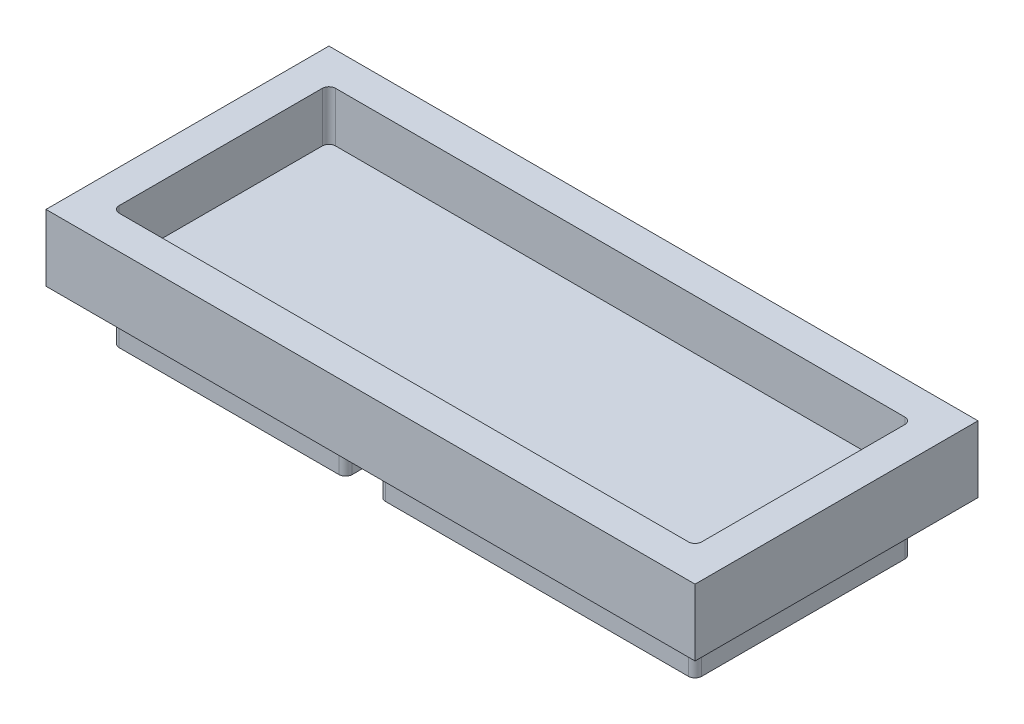
ISO-10303-21;
HEADER;
FILE_DESCRIPTION(('STEP AP214'),'2;1');
FILE_NAME('part.step','',(''),(''),'','','');
FILE_SCHEMA(('AUTOMOTIVE_DESIGN { 1 0 10303 214 1 1 1 1 }'));
ENDSEC;
DATA;
#1=APPLICATION_CONTEXT('core data for automotive mechanical design processes');
#2=APPLICATION_PROTOCOL_DEFINITION('international standard','automotive_design',2000,#1);
#3=PRODUCT_CONTEXT('',#1,'mechanical');
#4=PRODUCT('Part','Part','',(#3));
#5=PRODUCT_RELATED_PRODUCT_CATEGORY('part','',(#4));
#6=PRODUCT_DEFINITION_FORMATION('','',#4);
#7=PRODUCT_DEFINITION_CONTEXT('part definition',#1,'design');
#8=PRODUCT_DEFINITION('design','',#6,#7);
#9=PRODUCT_DEFINITION_SHAPE('','',#8);
#10=(LENGTH_UNIT() NAMED_UNIT(*) SI_UNIT(.MILLI.,.METRE.));
#11=(NAMED_UNIT(*) PLANE_ANGLE_UNIT() SI_UNIT($,.RADIAN.));
#12=(NAMED_UNIT(*) SI_UNIT($,.STERADIAN.) SOLID_ANGLE_UNIT());
#13=UNCERTAINTY_MEASURE_WITH_UNIT(LENGTH_MEASURE(1.E-05),#10,'distance_accuracy_value','');
#14=(GEOMETRIC_REPRESENTATION_CONTEXT(3) GLOBAL_UNCERTAINTY_ASSIGNED_CONTEXT((#13)) GLOBAL_UNIT_ASSIGNED_CONTEXT((#10,
#11,#12)) REPRESENTATION_CONTEXT('',''));
#15=CARTESIAN_POINT('',(0.,0.,0.));
#16=DIRECTION('',(0.,0.,1.));
#17=DIRECTION('',(1.,0.,0.));
#18=AXIS2_PLACEMENT_3D('',#15,#16,#17);
#19=CARTESIAN_POINT('',(-4.8482142857143,15.,3.70535714285713));
#20=DIRECTION('',(-1.,0.,0.));
#21=DIRECTION('',(0.,0.,1.));
#22=AXIS2_PLACEMENT_3D('',#19,#20,#21);
#23=PLANE('',#22);
#24=DIRECTION('',(0.,0.,-1.));
#25=VECTOR('',#24,1.);
#26=CARTESIAN_POINT('',(-4.8482142857143,0.,3.70535714285713));
#27=LINE('',#26,#25);
#28=CARTESIAN_POINT('',(-4.8482142857143,0.,3.70535714285713));
#29=VERTEX_POINT('',#28);
#30=CARTESIAN_POINT('',(-4.8482142857143,0.,-57.2946428571428));
#31=VERTEX_POINT('',#30);
#32=EDGE_CURVE('E419',#29,#31,#27,.T.);
#33=ORIENTED_EDGE('',*,*,#32,.T.);
#34=DIRECTION('',(0.,-1.,0.));
#35=VECTOR('',#34,1.);
#36=CARTESIAN_POINT('',(-4.8482142857143,15.,-57.2946428571428));
#37=LINE('',#36,#35);
#38=CARTESIAN_POINT('',(-4.8482142857143,15.,-57.2946428571428));
#39=VERTEX_POINT('',#38);
#40=EDGE_CURVE('E12',#39,#31,#37,.T.);
#41=ORIENTED_EDGE('',*,*,#40,.F.);
#42=DIRECTION('',(0.,0.,-1.));
#43=VECTOR('',#42,1.);
#44=CARTESIAN_POINT('',(-4.8482142857143,15.,3.70535714285713));
#45=LINE('',#44,#43);
#46=CARTESIAN_POINT('',(-4.8482142857143,15.,3.70535714285713));
#47=VERTEX_POINT('',#46);
#48=EDGE_CURVE('E420',#47,#39,#45,.T.);
#49=ORIENTED_EDGE('',*,*,#48,.F.);
#50=DIRECTION('',(0.,-1.,0.));
#51=VECTOR('',#50,1.);
#52=CARTESIAN_POINT('',(-4.8482142857143,15.,3.70535714285713));
#53=LINE('',#52,#51);
#54=EDGE_CURVE('E441',#47,#29,#53,.T.);
#55=ORIENTED_EDGE('',*,*,#54,.T.);
#56=EDGE_LOOP('',(#33,#41,#49,#55));
#57=FACE_BOUND('',#56,.T.);
#58=ADVANCED_FACE('F75',(#57),#23,.F.);
#59=CARTESIAN_POINT('',(-6.8482142857143,15.,-57.2946428571429));
#60=DIRECTION('',(0.,-1.,0.));
#61=DIRECTION('',(0.,0.,-1.));
#62=AXIS2_PLACEMENT_3D('',#59,#60,#61);
#63=CYLINDRICAL_SURFACE('',#62,2.);
#64=CARTESIAN_POINT('',(-6.8482142857143,0.,-57.2946428571429));
#65=DIRECTION('',(0.,1.,0.));
#66=DIRECTION('',(0.,0.,1.));
#67=AXIS2_PLACEMENT_3D('',#64,#65,#66);
#68=CIRCLE('',#67,2.);
#69=CARTESIAN_POINT('',(-6.84821428571432,0.,-59.2946428571429));
#70=VERTEX_POINT('',#69);
#71=EDGE_CURVE('E444',#31,#70,#68,.T.);
#72=ORIENTED_EDGE('',*,*,#71,.T.);
#73=DIRECTION('',(0.,-1.,0.));
#74=VECTOR('',#73,1.);
#75=CARTESIAN_POINT('',(-6.84821428571432,15.,-59.2946428571429));
#76=LINE('',#75,#74);
#77=CARTESIAN_POINT('',(-6.84821428571432,15.,-59.2946428571429));
#78=VERTEX_POINT('',#77);
#79=EDGE_CURVE('E82',#78,#70,#76,.T.);
#80=ORIENTED_EDGE('',*,*,#79,.F.);
#81=CARTESIAN_POINT('',(-6.8482142857143,15.,-57.2946428571429));
#82=DIRECTION('',(0.,1.,0.));
#83=DIRECTION('',(0.,0.,1.));
#84=AXIS2_PLACEMENT_3D('',#81,#82,#83);
#85=CIRCLE('',#84,2.);
#86=EDGE_CURVE('E422',#39,#78,#85,.T.);
#87=ORIENTED_EDGE('',*,*,#86,.F.);
#88=ORIENTED_EDGE('',*,*,#40,.T.);
#89=EDGE_LOOP('',(#72,#80,#87,#88));
#90=FACE_BOUND('',#89,.T.);
#91=ADVANCED_FACE('F481',(#90),#63,.T.);
#92=CARTESIAN_POINT('',(-72.8482142857143,15.,-59.2946428571429));
#93=DIRECTION('',(0.,0.,-1.));
#94=DIRECTION('',(-1.,0.,0.));
#95=AXIS2_PLACEMENT_3D('',#92,#93,#94);
#96=PLANE('',#95);
#97=DIRECTION('',(1.,0.,0.));
#98=VECTOR('',#97,1.);
#99=CARTESIAN_POINT('',(-72.8482142857143,0.,-59.2946428571429));
#100=LINE('',#99,#98);
#101=CARTESIAN_POINT('',(-72.8482142857143,0.,-59.2946428571429));
#102=VERTEX_POINT('',#101);
#103=EDGE_CURVE('E447',#102,#70,#100,.T.);
#104=ORIENTED_EDGE('',*,*,#103,.F.);
#105=DIRECTION('',(0.,-1.,0.));
#106=VECTOR('',#105,1.);
#107=CARTESIAN_POINT('',(-72.8482142857143,15.,-59.2946428571429));
#108=LINE('',#107,#106);
#109=CARTESIAN_POINT('',(-72.8482142857143,15.,-59.2946428571429));
#110=VERTEX_POINT('',#109);
#111=EDGE_CURVE('E473',#110,#102,#108,.T.);
#112=ORIENTED_EDGE('',*,*,#111,.F.);
#113=DIRECTION('',(1.,0.,0.));
#114=VECTOR('',#113,1.);
#115=CARTESIAN_POINT('',(-72.8482142857143,15.,-59.2946428571429));
#116=LINE('',#115,#114);
#117=EDGE_CURVE('E425',#110,#78,#116,.T.);
#118=ORIENTED_EDGE('',*,*,#117,.T.);
#119=ORIENTED_EDGE('',*,*,#79,.T.);
#120=EDGE_LOOP('',(#104,#112,#118,#119));
#121=FACE_BOUND('',#120,.T.);
#122=ADVANCED_FACE('F477',(#121),#96,.T.);
#123=CARTESIAN_POINT('',(-72.8482142857143,15.,-57.2946428571429));
#124=DIRECTION('',(0.,-1.,0.));
#125=DIRECTION('',(0.,0.,-1.));
#126=AXIS2_PLACEMENT_3D('',#123,#124,#125);
#127=CYLINDRICAL_SURFACE('',#126,2.);
#128=CARTESIAN_POINT('',(-72.8482142857143,0.,-57.2946428571429));
#129=DIRECTION('',(0.,-1.,0.));
#130=DIRECTION('',(0.,0.,-1.));
#131=AXIS2_PLACEMENT_3D('',#128,#129,#130);
#132=CIRCLE('',#131,2.);
#133=CARTESIAN_POINT('',(-74.8482142857143,0.,-57.2946428571428));
#134=VERTEX_POINT('',#133);
#135=EDGE_CURVE('E450',#134,#102,#132,.T.);
#136=ORIENTED_EDGE('',*,*,#135,.F.);
#137=DIRECTION('',(0.,-1.,0.));
#138=VECTOR('',#137,1.);
#139=CARTESIAN_POINT('',(-74.8482142857143,15.,-57.2946428571428));
#140=LINE('',#139,#138);
#141=CARTESIAN_POINT('',(-74.8482142857143,15.,-57.2946428571428));
#142=VERTEX_POINT('',#141);
#143=EDGE_CURVE('E471',#142,#134,#140,.T.);
#144=ORIENTED_EDGE('',*,*,#143,.F.);
#145=CARTESIAN_POINT('',(-72.8482142857143,15.,-57.2946428571429));
#146=DIRECTION('',(0.,-1.,0.));
#147=DIRECTION('',(0.,0.,-1.));
#148=AXIS2_PLACEMENT_3D('',#145,#146,#147);
#149=CIRCLE('',#148,2.);
#150=EDGE_CURVE('E428',#142,#110,#149,.T.);
#151=ORIENTED_EDGE('',*,*,#150,.T.);
#152=ORIENTED_EDGE('',*,*,#111,.T.);
#153=EDGE_LOOP('',(#136,#144,#151,#152));
#154=FACE_BOUND('',#153,.T.);
#155=ADVANCED_FACE('F491',(#154),#127,.T.);
#156=CARTESIAN_POINT('',(-74.8482142857143,15.,3.70535714285713));
#157=DIRECTION('',(-1.,0.,0.));
#158=DIRECTION('',(0.,0.,1.));
#159=AXIS2_PLACEMENT_3D('',#156,#157,#158);
#160=PLANE('',#159);
#161=DIRECTION('',(0.,0.,-1.));
#162=VECTOR('',#161,1.);
#163=CARTESIAN_POINT('',(-74.8482142857143,0.,3.70535714285713));
#164=LINE('',#163,#162);
#165=CARTESIAN_POINT('',(-74.8482142857143,0.,3.70535714285713));
#166=VERTEX_POINT('',#165);
#167=EDGE_CURVE('E453',#166,#134,#164,.T.);
#168=ORIENTED_EDGE('',*,*,#167,.F.);
#169=DIRECTION('',(0.,-1.,0.));
#170=VECTOR('',#169,1.);
#171=CARTESIAN_POINT('',(-74.8482142857143,15.,3.70535714285713));
#172=LINE('',#171,#170);
#173=CARTESIAN_POINT('',(-74.8482142857143,15.,3.70535714285713));
#174=VERTEX_POINT('',#173);
#175=EDGE_CURVE('E469',#174,#166,#172,.T.);
#176=ORIENTED_EDGE('',*,*,#175,.F.);
#177=DIRECTION('',(0.,0.,-1.));
#178=VECTOR('',#177,1.);
#179=CARTESIAN_POINT('',(-74.8482142857143,15.,3.70535714285713));
#180=LINE('',#179,#178);
#181=EDGE_CURVE('E431',#174,#142,#180,.T.);
#182=ORIENTED_EDGE('',*,*,#181,.T.);
#183=ORIENTED_EDGE('',*,*,#143,.T.);
#184=EDGE_LOOP('',(#168,#176,#182,#183));
#185=FACE_BOUND('',#184,.T.);
#186=ADVANCED_FACE('F509',(#185),#160,.T.);
#187=CARTESIAN_POINT('',(-72.8482142857143,15.,3.70535714285715));
#188=DIRECTION('',(0.,-1.,0.));
#189=DIRECTION('',(0.,0.,-1.));
#190=AXIS2_PLACEMENT_3D('',#187,#188,#189);
#191=CYLINDRICAL_SURFACE('',#190,2.);
#192=CARTESIAN_POINT('',(-72.8482142857143,0.,3.70535714285715));
#193=DIRECTION('',(0.,1.,0.));
#194=DIRECTION('',(0.,0.,1.));
#195=AXIS2_PLACEMENT_3D('',#192,#193,#194);
#196=CIRCLE('',#195,2.);
#197=CARTESIAN_POINT('',(-72.8482142857143,0.,5.70535714285715));
#198=VERTEX_POINT('',#197);
#199=EDGE_CURVE('E456',#166,#198,#196,.T.);
#200=ORIENTED_EDGE('',*,*,#199,.T.);
#201=DIRECTION('',(0.,-1.,0.));
#202=VECTOR('',#201,1.);
#203=CARTESIAN_POINT('',(-72.8482142857143,15.,5.70535714285715));
#204=LINE('',#203,#202);
#205=CARTESIAN_POINT('',(-72.8482142857143,15.,5.70535714285715));
#206=VERTEX_POINT('',#205);
#207=EDGE_CURVE('E466',#206,#198,#204,.T.);
#208=ORIENTED_EDGE('',*,*,#207,.F.);
#209=CARTESIAN_POINT('',(-72.8482142857143,15.,3.70535714285715));
#210=DIRECTION('',(0.,1.,0.));
#211=DIRECTION('',(0.,0.,1.));
#212=AXIS2_PLACEMENT_3D('',#209,#210,#211);
#213=CIRCLE('',#212,2.);
#214=EDGE_CURVE('E434',#174,#206,#213,.T.);
#215=ORIENTED_EDGE('',*,*,#214,.F.);
#216=ORIENTED_EDGE('',*,*,#175,.T.);
#217=EDGE_LOOP('',(#200,#208,#215,#216));
#218=FACE_BOUND('',#217,.T.);
#219=ADVANCED_FACE('F511',(#218),#191,.T.);
#220=CARTESIAN_POINT('',(-72.8482142857143,15.,5.70535714285715));
#221=DIRECTION('',(0.,0.,-1.));
#222=DIRECTION('',(-1.,0.,0.));
#223=AXIS2_PLACEMENT_3D('',#220,#221,#222);
#224=PLANE('',#223);
#225=DIRECTION('',(1.,0.,0.));
#226=VECTOR('',#225,1.);
#227=CARTESIAN_POINT('',(-72.8482142857143,0.,5.70535714285715));
#228=LINE('',#227,#226);
#229=CARTESIAN_POINT('',(-6.84821428571432,0.,5.70535714285715));
#230=VERTEX_POINT('',#229);
#231=EDGE_CURVE('E458',#198,#230,#228,.T.);
#232=ORIENTED_EDGE('',*,*,#231,.T.);
#233=DIRECTION('',(0.,-1.,0.));
#234=VECTOR('',#233,1.);
#235=CARTESIAN_POINT('',(-6.84821428571432,15.,5.70535714285715));
#236=LINE('',#235,#234);
#237=CARTESIAN_POINT('',(-6.84821428571432,15.,5.70535714285715));
#238=VERTEX_POINT('',#237);
#239=EDGE_CURVE('E464',#238,#230,#236,.T.);
#240=ORIENTED_EDGE('',*,*,#239,.F.);
#241=DIRECTION('',(1.,0.,0.));
#242=VECTOR('',#241,1.);
#243=CARTESIAN_POINT('',(-72.8482142857143,15.,5.70535714285715));
#244=LINE('',#243,#242);
#245=EDGE_CURVE('E436',#206,#238,#244,.T.);
#246=ORIENTED_EDGE('',*,*,#245,.F.);
#247=ORIENTED_EDGE('',*,*,#207,.T.);
#248=EDGE_LOOP('',(#232,#240,#246,#247));
#249=FACE_BOUND('',#248,.T.);
#250=ADVANCED_FACE('F505',(#249),#224,.F.);
#251=CARTESIAN_POINT('',(-6.8482142857143,15.,3.70535714285715));
#252=DIRECTION('',(0.,-1.,0.));
#253=DIRECTION('',(0.,0.,-1.));
#254=AXIS2_PLACEMENT_3D('',#251,#252,#253);
#255=CYLINDRICAL_SURFACE('',#254,2.);
#256=CARTESIAN_POINT('',(-6.8482142857143,0.,3.70535714285715));
#257=DIRECTION('',(0.,-1.,0.));
#258=DIRECTION('',(0.,0.,-1.));
#259=AXIS2_PLACEMENT_3D('',#256,#257,#258);
#260=CIRCLE('',#259,2.);
#261=EDGE_CURVE('E423',#29,#230,#260,.T.);
#262=ORIENTED_EDGE('',*,*,#261,.F.);
#263=ORIENTED_EDGE('',*,*,#54,.F.);
#264=CARTESIAN_POINT('',(-6.8482142857143,15.,3.70535714285715));
#265=DIRECTION('',(0.,-1.,0.));
#266=DIRECTION('',(0.,0.,-1.));
#267=AXIS2_PLACEMENT_3D('',#264,#265,#266);
#268=CIRCLE('',#267,2.);
#269=EDGE_CURVE('E438',#47,#238,#268,.T.);
#270=ORIENTED_EDGE('',*,*,#269,.T.);
#271=ORIENTED_EDGE('',*,*,#239,.T.);
#272=EDGE_LOOP('',(#262,#263,#270,#271));
#273=FACE_BOUND('',#272,.T.);
#274=ADVANCED_FACE('F501',(#273),#255,.T.);
#275=CARTESIAN_POINT('',(-6.8482142857143,0.,-57.2946428571429));
#276=DIRECTION('',(0.,1.,0.));
#277=DIRECTION('',(0.,0.,1.));
#278=AXIS2_PLACEMENT_3D('',#275,#276,#277);
#279=PLANE('',#278);
#280=ORIENTED_EDGE('',*,*,#32,.F.);
#281=ORIENTED_EDGE('',*,*,#261,.T.);
#282=ORIENTED_EDGE('',*,*,#231,.F.);
#283=ORIENTED_EDGE('',*,*,#199,.F.);
#284=ORIENTED_EDGE('',*,*,#167,.T.);
#285=ORIENTED_EDGE('',*,*,#135,.T.);
#286=ORIENTED_EDGE('',*,*,#103,.T.);
#287=ORIENTED_EDGE('',*,*,#71,.F.);
#288=EDGE_LOOP('',(#280,#281,#282,#283,#284,#285,#286,#287));
#289=FACE_BOUND('',#288,.T.);
#290=ADVANCED_FACE('F485',(#289),#279,.F.);
#291=CARTESIAN_POINT('',(0.,15.,0.));
#292=DIRECTION('',(0.,1.,0.));
#293=DIRECTION('',(0.,0.,1.));
#294=AXIS2_PLACEMENT_3D('',#291,#292,#293);
#295=PLANE('',#294);
#296=DIRECTION('',(1.,0.,0.));
#297=VECTOR('',#296,1.);
#298=CARTESIAN_POINT('',(7.15178571428571,15.,5.70535714285715));
#299=LINE('',#298,#297);
#300=CARTESIAN_POINT('',(7.1517857142857,15.,5.70535714285715));
#301=VERTEX_POINT('',#300);
#302=CARTESIAN_POINT('',(98.1517857142857,15.,5.70535714285715));
#303=VERTEX_POINT('',#302);
#304=EDGE_CURVE('E396',#301,#303,#299,.T.);
#305=ORIENTED_EDGE('',*,*,#304,.T.);
#306=CARTESIAN_POINT('',(98.1517857142857,15.,3.70535714285715));
#307=DIRECTION('',(0.,-1.,0.));
#308=DIRECTION('',(0.,0.,-1.));
#309=AXIS2_PLACEMENT_3D('',#306,#307,#308);
#310=CIRCLE('',#309,2.);
#311=CARTESIAN_POINT('',(100.151785714286,15.,3.70535714285713));
#312=VERTEX_POINT('',#311);
#313=EDGE_CURVE('E97',#312,#303,#310,.T.);
#314=ORIENTED_EDGE('',*,*,#313,.F.);
#315=DIRECTION('',(0.,0.,-1.));
#316=VECTOR('',#315,1.);
#317=CARTESIAN_POINT('',(100.151785714286,15.,3.70535714285713));
#318=LINE('',#317,#316);
#319=CARTESIAN_POINT('',(100.151785714286,15.,-57.2946428571428));
#320=VERTEX_POINT('',#319);
#321=EDGE_CURVE('E342',#312,#320,#318,.T.);
#322=ORIENTED_EDGE('',*,*,#321,.T.);
#323=CARTESIAN_POINT('',(98.1517857142857,15.,-57.2946428571429));
#324=DIRECTION('',(0.,-1.,0.));
#325=DIRECTION('',(0.,0.,-1.));
#326=AXIS2_PLACEMENT_3D('',#323,#324,#325);
#327=CIRCLE('',#326,2.);
#328=CARTESIAN_POINT('',(98.1517857142857,15.,-59.2946428571429));
#329=VERTEX_POINT('',#328);
#330=EDGE_CURVE('E382',#329,#320,#327,.T.);
#331=ORIENTED_EDGE('',*,*,#330,.F.);
#332=DIRECTION('',(1.,0.,0.));
#333=VECTOR('',#332,1.);
#334=CARTESIAN_POINT('',(7.15178571428571,15.,-59.2946428571429));
#335=LINE('',#334,#333);
#336=CARTESIAN_POINT('',(7.15178571428571,15.,-59.2946428571429));
#337=VERTEX_POINT('',#336);
#338=EDGE_CURVE('E385',#337,#329,#335,.T.);
#339=ORIENTED_EDGE('',*,*,#338,.F.);
#340=CARTESIAN_POINT('',(7.1517857142857,15.,-57.2946428571429));
#341=DIRECTION('',(0.,-1.,0.));
#342=DIRECTION('',(0.,0.,-1.));
#343=AXIS2_PLACEMENT_3D('',#340,#341,#342);
#344=CIRCLE('',#343,2.);
#345=CARTESIAN_POINT('',(5.1517857142857,15.,-57.2946428571428));
#346=VERTEX_POINT('',#345);
#347=EDGE_CURVE('E388',#346,#337,#344,.T.);
#348=ORIENTED_EDGE('',*,*,#347,.F.);
#349=DIRECTION('',(0.,0.,-1.));
#350=VECTOR('',#349,1.);
#351=CARTESIAN_POINT('',(5.1517857142857,15.,3.70535714285713));
#352=LINE('',#351,#350);
#353=CARTESIAN_POINT('',(5.1517857142857,15.,3.70535714285713));
#354=VERTEX_POINT('',#353);
#355=EDGE_CURVE('E391',#354,#346,#352,.T.);
#356=ORIENTED_EDGE('',*,*,#355,.F.);
#357=CARTESIAN_POINT('',(7.1517857142857,15.,3.70535714285715));
#358=DIRECTION('',(0.,1.,0.));
#359=DIRECTION('',(0.,0.,1.));
#360=AXIS2_PLACEMENT_3D('',#357,#358,#359);
#361=CIRCLE('',#360,2.);
#362=EDGE_CURVE('E394',#354,#301,#361,.T.);
#363=ORIENTED_EDGE('',*,*,#362,.T.);
#364=EDGE_LOOP('',(#305,#314,#322,#331,#339,#348,#356,#363));
#365=FACE_BOUND('',#364,.T.);
#366=DIRECTION('',(0.,0.,1.));
#367=VECTOR('',#366,1.);
#368=CARTESIAN_POINT('',(-84.8482142857143,15.,-69.2946428571429));
#369=LINE('',#368,#367);
#370=CARTESIAN_POINT('',(-84.8482142857143,15.,-69.2946428571429));
#371=VERTEX_POINT('',#370);
#372=CARTESIAN_POINT('',(-84.8482142857143,15.,15.7053571428571));
#373=VERTEX_POINT('',#372);
#374=EDGE_CURVE('E380',#371,#373,#369,.T.);
#375=ORIENTED_EDGE('',*,*,#374,.F.);
#376=DIRECTION('',(-1.,0.,0.));
#377=VECTOR('',#376,1.);
#378=CARTESIAN_POINT('',(-84.8482142857143,15.,-69.2946428571429));
#379=LINE('',#378,#377);
#380=CARTESIAN_POINT('',(110.151785714286,15.,-69.2946428571429));
#381=VERTEX_POINT('',#380);
#382=EDGE_CURVE('E405',#381,#371,#379,.T.);
#383=ORIENTED_EDGE('',*,*,#382,.F.);
#384=DIRECTION('',(0.,0.,-1.));
#385=VECTOR('',#384,1.);
#386=CARTESIAN_POINT('',(110.151785714286,15.,-69.2946428571429));
#387=LINE('',#386,#385);
#388=CARTESIAN_POINT('',(110.151785714286,15.,15.7053571428571));
#389=VERTEX_POINT('',#388);
#390=EDGE_CURVE('E403',#389,#381,#387,.T.);
#391=ORIENTED_EDGE('',*,*,#390,.F.);
#392=DIRECTION('',(1.,0.,0.));
#393=VECTOR('',#392,1.);
#394=CARTESIAN_POINT('',(-84.8482142857143,15.,15.7053571428571));
#395=LINE('',#394,#393);
#396=EDGE_CURVE('E401',#373,#389,#395,.T.);
#397=ORIENTED_EDGE('',*,*,#396,.F.);
#398=EDGE_LOOP('',(#375,#383,#391,#397));
#399=FACE_BOUND('',#398,.T.);
#400=ORIENTED_EDGE('',*,*,#269,.F.);
#401=ORIENTED_EDGE('',*,*,#48,.T.);
#402=ORIENTED_EDGE('',*,*,#86,.T.);
#403=ORIENTED_EDGE('',*,*,#117,.F.);
#404=ORIENTED_EDGE('',*,*,#150,.F.);
#405=ORIENTED_EDGE('',*,*,#181,.F.);
#406=ORIENTED_EDGE('',*,*,#214,.T.);
#407=ORIENTED_EDGE('',*,*,#245,.T.);
#408=EDGE_LOOP('',(#400,#401,#402,#403,#404,#405,#406,#407));
#409=FACE_BOUND('',#408,.T.);
#410=ADVANCED_FACE('F493',(#365,#399,#409),#295,.F.);
#411=CARTESIAN_POINT('',(-84.8482142857143,20.,-69.2946428571429));
#412=DIRECTION('',(1.,0.,0.));
#413=DIRECTION('',(0.,0.,-1.));
#414=AXIS2_PLACEMENT_3D('',#411,#412,#413);
#415=PLANE('',#414);
#416=ORIENTED_EDGE('',*,*,#374,.T.);
#417=DIRECTION('',(0.,-1.,0.));
#418=VECTOR('',#417,1.);
#419=CARTESIAN_POINT('',(-84.8482142857143,20.,15.7053571428571));
#420=LINE('',#419,#418);
#421=CARTESIAN_POINT('',(-84.8482142857143,35.,15.7053571428571));
#422=VERTEX_POINT('',#421);
#423=EDGE_CURVE('E416',#422,#373,#420,.T.);
#424=ORIENTED_EDGE('',*,*,#423,.F.);
#425=DIRECTION('',(0.,0.,1.));
#426=VECTOR('',#425,1.);
#427=CARTESIAN_POINT('',(-84.8482142857143,35.,-69.2946428571429));
#428=LINE('',#427,#426);
#429=CARTESIAN_POINT('',(-84.8482142857143,35.,-69.2946428571429));
#430=VERTEX_POINT('',#429);
#431=EDGE_CURVE('E330',#430,#422,#428,.T.);
#432=ORIENTED_EDGE('',*,*,#431,.F.);
#433=DIRECTION('',(0.,-1.,0.));
#434=VECTOR('',#433,1.);
#435=CARTESIAN_POINT('',(-84.8482142857143,20.,-69.2946428571429));
#436=LINE('',#435,#434);
#437=EDGE_CURVE('E407',#430,#371,#436,.T.);
#438=ORIENTED_EDGE('',*,*,#437,.T.);
#439=EDGE_LOOP('',(#416,#424,#432,#438));
#440=FACE_BOUND('',#439,.T.);
#441=ADVANCED_FACE('F657',(#440),#415,.F.);
#442=CARTESIAN_POINT('',(-84.8482142857143,20.,15.7053571428571));
#443=DIRECTION('',(0.,0.,-1.));
#444=DIRECTION('',(-1.,0.,0.));
#445=AXIS2_PLACEMENT_3D('',#442,#443,#444);
#446=PLANE('',#445);
#447=ORIENTED_EDGE('',*,*,#396,.T.);
#448=DIRECTION('',(0.,-1.,0.));
#449=VECTOR('',#448,1.);
#450=CARTESIAN_POINT('',(110.151785714286,20.,15.7053571428571));
#451=LINE('',#450,#449);
#452=CARTESIAN_POINT('',(110.151785714286,35.,15.7053571428571));
#453=VERTEX_POINT('',#452);
#454=EDGE_CURVE('E413',#453,#389,#451,.T.);
#455=ORIENTED_EDGE('',*,*,#454,.F.);
#456=DIRECTION('',(1.,0.,0.));
#457=VECTOR('',#456,1.);
#458=CARTESIAN_POINT('',(-84.8482142857143,35.,15.7053571428571));
#459=LINE('',#458,#457);
#460=EDGE_CURVE('E333',#422,#453,#459,.T.);
#461=ORIENTED_EDGE('',*,*,#460,.F.);
#462=ORIENTED_EDGE('',*,*,#423,.T.);
#463=EDGE_LOOP('',(#447,#455,#461,#462));
#464=FACE_BOUND('',#463,.T.);
#465=ADVANCED_FACE('F667',(#464),#446,.F.);
#466=CARTESIAN_POINT('',(110.151785714286,20.,-69.2946428571429));
#467=DIRECTION('',(-1.,0.,0.));
#468=DIRECTION('',(0.,0.,1.));
#469=AXIS2_PLACEMENT_3D('',#466,#467,#468);
#470=PLANE('',#469);
#471=ORIENTED_EDGE('',*,*,#390,.T.);
#472=DIRECTION('',(0.,-1.,0.));
#473=VECTOR('',#472,1.);
#474=CARTESIAN_POINT('',(110.151785714286,20.,-69.2946428571429));
#475=LINE('',#474,#473);
#476=CARTESIAN_POINT('',(110.151785714286,35.,-69.2946428571429));
#477=VERTEX_POINT('',#476);
#478=EDGE_CURVE('E410',#477,#381,#475,.T.);
#479=ORIENTED_EDGE('',*,*,#478,.F.);
#480=DIRECTION('',(0.,0.,-1.));
#481=VECTOR('',#480,1.);
#482=CARTESIAN_POINT('',(110.151785714286,35.,15.7053571428571));
#483=LINE('',#482,#481);
#484=EDGE_CURVE('E336',#453,#477,#483,.T.);
#485=ORIENTED_EDGE('',*,*,#484,.F.);
#486=ORIENTED_EDGE('',*,*,#454,.T.);
#487=EDGE_LOOP('',(#471,#479,#485,#486));
#488=FACE_BOUND('',#487,.T.);
#489=ADVANCED_FACE('F680',(#488),#470,.F.);
#490=CARTESIAN_POINT('',(-84.8482142857143,20.,-69.2946428571429));
#491=DIRECTION('',(0.,0.,1.));
#492=DIRECTION('',(1.,0.,0.));
#493=AXIS2_PLACEMENT_3D('',#490,#491,#492);
#494=PLANE('',#493);
#495=ORIENTED_EDGE('',*,*,#382,.T.);
#496=ORIENTED_EDGE('',*,*,#437,.F.);
#497=DIRECTION('',(-1.,0.,0.));
#498=VECTOR('',#497,1.);
#499=CARTESIAN_POINT('',(110.151785714286,35.,-69.2946428571429));
#500=LINE('',#499,#498);
#501=EDGE_CURVE('E276',#477,#430,#500,.T.);
#502=ORIENTED_EDGE('',*,*,#501,.F.);
#503=ORIENTED_EDGE('',*,*,#478,.T.);
#504=EDGE_LOOP('',(#495,#496,#502,#503));
#505=FACE_BOUND('',#504,.T.);
#506=ADVANCED_FACE('F578',(#505),#494,.F.);
#507=CARTESIAN_POINT('',(98.1517857142857,15.,3.70535714285715));
#508=DIRECTION('',(0.,-1.,0.));
#509=DIRECTION('',(0.,0.,-1.));
#510=AXIS2_PLACEMENT_3D('',#507,#508,#509);
#511=CYLINDRICAL_SURFACE('',#510,2.);
#512=CARTESIAN_POINT('',(98.1517857142857,0.,3.70535714285715));
#513=DIRECTION('',(0.,-1.,0.));
#514=DIRECTION('',(0.,0.,-1.));
#515=AXIS2_PLACEMENT_3D('',#512,#513,#514);
#516=CIRCLE('',#515,2.);
#517=CARTESIAN_POINT('',(100.151785714286,0.,3.70535714285713));
#518=VERTEX_POINT('',#517);
#519=CARTESIAN_POINT('',(98.1517857142857,0.,5.70535714285715));
#520=VERTEX_POINT('',#519);
#521=EDGE_CURVE('E377',#518,#520,#516,.T.);
#522=ORIENTED_EDGE('',*,*,#521,.F.);
#523=DIRECTION('',(0.,-1.,0.));
#524=VECTOR('',#523,1.);
#525=CARTESIAN_POINT('',(100.151785714286,15.,3.70535714285713));
#526=LINE('',#525,#524);
#527=EDGE_CURVE('E339',#312,#518,#526,.T.);
#528=ORIENTED_EDGE('',*,*,#527,.F.);
#529=ORIENTED_EDGE('',*,*,#313,.T.);
#530=DIRECTION('',(0.,-1.,0.));
#531=VECTOR('',#530,1.);
#532=CARTESIAN_POINT('',(98.1517857142857,15.,5.70535714285715));
#533=LINE('',#532,#531);
#534=EDGE_CURVE('E340',#303,#520,#533,.T.);
#535=ORIENTED_EDGE('',*,*,#534,.T.);
#536=EDGE_LOOP('',(#522,#528,#529,#535));
#537=FACE_BOUND('',#536,.T.);
#538=ADVANCED_FACE('F572',(#537),#511,.T.);
#539=CARTESIAN_POINT('',(100.151785714286,15.,3.70535714285713));
#540=DIRECTION('',(-1.,0.,0.));
#541=DIRECTION('',(0.,0.,1.));
#542=AXIS2_PLACEMENT_3D('',#539,#540,#541);
#543=PLANE('',#542);
#544=DIRECTION('',(0.,0.,-1.));
#545=VECTOR('',#544,1.);
#546=CARTESIAN_POINT('',(100.151785714286,0.,3.70535714285713));
#547=LINE('',#546,#545);
#548=CARTESIAN_POINT('',(100.151785714286,0.,-57.2946428571428));
#549=VERTEX_POINT('',#548);
#550=EDGE_CURVE('E357',#518,#549,#547,.T.);
#551=ORIENTED_EDGE('',*,*,#550,.T.);
#552=DIRECTION('',(0.,-1.,0.));
#553=VECTOR('',#552,1.);
#554=CARTESIAN_POINT('',(100.151785714286,15.,-57.2946428571428));
#555=LINE('',#554,#553);
#556=EDGE_CURVE('E354',#320,#549,#555,.T.);
#557=ORIENTED_EDGE('',*,*,#556,.F.);
#558=ORIENTED_EDGE('',*,*,#321,.F.);
#559=ORIENTED_EDGE('',*,*,#527,.T.);
#560=EDGE_LOOP('',(#551,#557,#558,#559));
#561=FACE_BOUND('',#560,.T.);
#562=ADVANCED_FACE('F577',(#561),#543,.F.);
#563=CARTESIAN_POINT('',(98.1517857142857,15.,-57.2946428571429));
#564=DIRECTION('',(0.,-1.,0.));
#565=DIRECTION('',(0.,0.,-1.));
#566=AXIS2_PLACEMENT_3D('',#563,#564,#565);
#567=CYLINDRICAL_SURFACE('',#566,2.);
#568=CARTESIAN_POINT('',(98.1517857142857,0.,-57.2946428571429));
#569=DIRECTION('',(0.,-1.,0.));
#570=DIRECTION('',(0.,0.,-1.));
#571=AXIS2_PLACEMENT_3D('',#568,#569,#570);
#572=CIRCLE('',#571,2.);
#573=CARTESIAN_POINT('',(98.1517857142857,0.,-59.2946428571429));
#574=VERTEX_POINT('',#573);
#575=EDGE_CURVE('E360',#574,#549,#572,.T.);
#576=ORIENTED_EDGE('',*,*,#575,.F.);
#577=DIRECTION('',(0.,-1.,0.));
#578=VECTOR('',#577,1.);
#579=CARTESIAN_POINT('',(98.1517857142857,15.,-59.2946428571429));
#580=LINE('',#579,#578);
#581=EDGE_CURVE('E352',#329,#574,#580,.T.);
#582=ORIENTED_EDGE('',*,*,#581,.F.);
#583=ORIENTED_EDGE('',*,*,#330,.T.);
#584=ORIENTED_EDGE('',*,*,#556,.T.);
#585=EDGE_LOOP('',(#576,#582,#583,#584));
#586=FACE_BOUND('',#585,.T.);
#587=ADVANCED_FACE('F587',(#586),#567,.T.);
#588=CARTESIAN_POINT('',(7.15178571428571,15.,-59.2946428571429));
#589=DIRECTION('',(0.,0.,-1.));
#590=DIRECTION('',(-1.,0.,0.));
#591=AXIS2_PLACEMENT_3D('',#588,#589,#590);
#592=PLANE('',#591);
#593=DIRECTION('',(1.,0.,0.));
#594=VECTOR('',#593,1.);
#595=CARTESIAN_POINT('',(7.15178571428571,0.,-59.2946428571429));
#596=LINE('',#595,#594);
#597=CARTESIAN_POINT('',(7.15178571428571,0.,-59.2946428571429));
#598=VERTEX_POINT('',#597);
#599=EDGE_CURVE('E363',#598,#574,#596,.T.);
#600=ORIENTED_EDGE('',*,*,#599,.F.);
#601=DIRECTION('',(0.,-1.,0.));
#602=VECTOR('',#601,1.);
#603=CARTESIAN_POINT('',(7.15178571428571,15.,-59.2946428571429));
#604=LINE('',#603,#602);
#605=EDGE_CURVE('E350',#337,#598,#604,.T.);
#606=ORIENTED_EDGE('',*,*,#605,.F.);
#607=ORIENTED_EDGE('',*,*,#338,.T.);
#608=ORIENTED_EDGE('',*,*,#581,.T.);
#609=EDGE_LOOP('',(#600,#606,#607,#608));
#610=FACE_BOUND('',#609,.T.);
#611=ADVANCED_FACE('F596',(#610),#592,.T.);
#612=CARTESIAN_POINT('',(7.1517857142857,15.,-57.2946428571429));
#613=DIRECTION('',(0.,-1.,0.));
#614=DIRECTION('',(0.,0.,-1.));
#615=AXIS2_PLACEMENT_3D('',#612,#613,#614);
#616=CYLINDRICAL_SURFACE('',#615,2.);
#617=CARTESIAN_POINT('',(7.1517857142857,0.,-57.2946428571429));
#618=DIRECTION('',(0.,-1.,0.));
#619=DIRECTION('',(0.,0.,-1.));
#620=AXIS2_PLACEMENT_3D('',#617,#618,#619);
#621=CIRCLE('',#620,2.);
#622=CARTESIAN_POINT('',(5.1517857142857,0.,-57.2946428571428));
#623=VERTEX_POINT('',#622);
#624=EDGE_CURVE('E366',#623,#598,#621,.T.);
#625=ORIENTED_EDGE('',*,*,#624,.F.);
#626=DIRECTION('',(0.,-1.,0.));
#627=VECTOR('',#626,1.);
#628=CARTESIAN_POINT('',(5.1517857142857,15.,-57.2946428571428));
#629=LINE('',#628,#627);
#630=EDGE_CURVE('E348',#346,#623,#629,.T.);
#631=ORIENTED_EDGE('',*,*,#630,.F.);
#632=ORIENTED_EDGE('',*,*,#347,.T.);
#633=ORIENTED_EDGE('',*,*,#605,.T.);
#634=EDGE_LOOP('',(#625,#631,#632,#633));
#635=FACE_BOUND('',#634,.T.);
#636=ADVANCED_FACE('F605',(#635),#616,.T.);
#637=CARTESIAN_POINT('',(5.1517857142857,15.,3.70535714285713));
#638=DIRECTION('',(-1.,0.,0.));
#639=DIRECTION('',(0.,0.,1.));
#640=AXIS2_PLACEMENT_3D('',#637,#638,#639);
#641=PLANE('',#640);
#642=DIRECTION('',(0.,0.,-1.));
#643=VECTOR('',#642,1.);
#644=CARTESIAN_POINT('',(5.1517857142857,0.,3.70535714285713));
#645=LINE('',#644,#643);
#646=CARTESIAN_POINT('',(5.1517857142857,0.,3.70535714285713));
#647=VERTEX_POINT('',#646);
#648=EDGE_CURVE('E369',#647,#623,#645,.T.);
#649=ORIENTED_EDGE('',*,*,#648,.F.);
#650=DIRECTION('',(0.,-1.,0.));
#651=VECTOR('',#650,1.);
#652=CARTESIAN_POINT('',(5.1517857142857,15.,3.70535714285713));
#653=LINE('',#652,#651);
#654=EDGE_CURVE('E346',#354,#647,#653,.T.);
#655=ORIENTED_EDGE('',*,*,#654,.F.);
#656=ORIENTED_EDGE('',*,*,#355,.T.);
#657=ORIENTED_EDGE('',*,*,#630,.T.);
#658=EDGE_LOOP('',(#649,#655,#656,#657));
#659=FACE_BOUND('',#658,.T.);
#660=ADVANCED_FACE('F614',(#659),#641,.T.);
#661=CARTESIAN_POINT('',(7.1517857142857,15.,3.70535714285715));
#662=DIRECTION('',(0.,-1.,0.));
#663=DIRECTION('',(0.,0.,-1.));
#664=AXIS2_PLACEMENT_3D('',#661,#662,#663);
#665=CYLINDRICAL_SURFACE('',#664,2.);
#666=CARTESIAN_POINT('',(7.1517857142857,0.,3.70535714285715));
#667=DIRECTION('',(0.,1.,0.));
#668=DIRECTION('',(0.,0.,1.));
#669=AXIS2_PLACEMENT_3D('',#666,#667,#668);
#670=CIRCLE('',#669,2.);
#671=CARTESIAN_POINT('',(7.1517857142857,0.,5.70535714285715));
#672=VERTEX_POINT('',#671);
#673=EDGE_CURVE('E372',#647,#672,#670,.T.);
#674=ORIENTED_EDGE('',*,*,#673,.T.);
#675=DIRECTION('',(0.,-1.,0.));
#676=VECTOR('',#675,1.);
#677=CARTESIAN_POINT('',(7.1517857142857,15.,5.70535714285715));
#678=LINE('',#677,#676);
#679=EDGE_CURVE('E343',#301,#672,#678,.T.);
#680=ORIENTED_EDGE('',*,*,#679,.F.);
#681=ORIENTED_EDGE('',*,*,#362,.F.);
#682=ORIENTED_EDGE('',*,*,#654,.T.);
#683=EDGE_LOOP('',(#674,#680,#681,#682));
#684=FACE_BOUND('',#683,.T.);
#685=ADVANCED_FACE('F623',(#684),#665,.T.);
#686=CARTESIAN_POINT('',(7.15178571428571,15.,5.70535714285715));
#687=DIRECTION('',(0.,0.,-1.));
#688=DIRECTION('',(-1.,0.,0.));
#689=AXIS2_PLACEMENT_3D('',#686,#687,#688);
#690=PLANE('',#689);
#691=DIRECTION('',(1.,0.,0.));
#692=VECTOR('',#691,1.);
#693=CARTESIAN_POINT('',(7.15178571428571,0.,5.70535714285715));
#694=LINE('',#693,#692);
#695=EDGE_CURVE('E374',#672,#520,#694,.T.);
#696=ORIENTED_EDGE('',*,*,#695,.T.);
#697=ORIENTED_EDGE('',*,*,#534,.F.);
#698=ORIENTED_EDGE('',*,*,#304,.F.);
#699=ORIENTED_EDGE('',*,*,#679,.T.);
#700=EDGE_LOOP('',(#696,#697,#698,#699));
#701=FACE_BOUND('',#700,.T.);
#702=ADVANCED_FACE('F632',(#701),#690,.F.);
#703=CARTESIAN_POINT('',(98.1517857142857,0.,3.70535714285715));
#704=DIRECTION('',(0.,-1.,0.));
#705=DIRECTION('',(0.,0.,-1.));
#706=AXIS2_PLACEMENT_3D('',#703,#704,#705);
#707=PLANE('',#706);
#708=ORIENTED_EDGE('',*,*,#521,.T.);
#709=ORIENTED_EDGE('',*,*,#695,.F.);
#710=ORIENTED_EDGE('',*,*,#673,.F.);
#711=ORIENTED_EDGE('',*,*,#648,.T.);
#712=ORIENTED_EDGE('',*,*,#624,.T.);
#713=ORIENTED_EDGE('',*,*,#599,.T.);
#714=ORIENTED_EDGE('',*,*,#575,.T.);
#715=ORIENTED_EDGE('',*,*,#550,.F.);
#716=EDGE_LOOP('',(#708,#709,#710,#711,#712,#713,#714,#715));
#717=FACE_BOUND('',#716,.T.);
#718=ADVANCED_FACE('F641',(#717),#707,.T.);
#719=CARTESIAN_POINT('',(0.,35.,0.));
#720=DIRECTION('',(0.,1.,0.));
#721=DIRECTION('',(0.,0.,1.));
#722=AXIS2_PLACEMENT_3D('',#719,#720,#721);
#723=PLANE('',#722);
#724=ORIENTED_EDGE('',*,*,#501,.T.);
#725=ORIENTED_EDGE('',*,*,#431,.T.);
#726=ORIENTED_EDGE('',*,*,#460,.T.);
#727=ORIENTED_EDGE('',*,*,#484,.T.);
#728=EDGE_LOOP('',(#724,#725,#726,#727));
#729=FACE_BOUND('',#728,.T.);
#730=CARTESIAN_POINT('',(-72.8482142857143,35.,3.70535714285715));
#731=DIRECTION('',(0.,1.,0.));
#732=DIRECTION('',(0.,0.,1.));
#733=AXIS2_PLACEMENT_3D('',#730,#731,#732);
#734=CIRCLE('',#733,2.);
#735=CARTESIAN_POINT('',(-74.8482142857143,35.,3.70535714285713));
#736=VERTEX_POINT('',#735);
#737=CARTESIAN_POINT('',(-72.8482142857143,35.,5.70535714285715));
#738=VERTEX_POINT('',#737);
#739=EDGE_CURVE('E268',#736,#738,#734,.T.);
#740=ORIENTED_EDGE('',*,*,#739,.F.);
#741=DIRECTION('',(0.,0.,1.));
#742=VECTOR('',#741,1.);
#743=CARTESIAN_POINT('',(-74.8482142857143,35.,-57.2946428571428));
#744=LINE('',#743,#742);
#745=CARTESIAN_POINT('',(-74.8482142857143,35.,-57.2946428571428));
#746=VERTEX_POINT('',#745);
#747=EDGE_CURVE('E260',#746,#736,#744,.T.);
#748=ORIENTED_EDGE('',*,*,#747,.F.);
#749=CARTESIAN_POINT('',(-72.8482142857143,35.,-57.2946428571429));
#750=DIRECTION('',(0.,-1.,0.));
#751=DIRECTION('',(0.,0.,-1.));
#752=AXIS2_PLACEMENT_3D('',#749,#750,#751);
#753=CIRCLE('',#752,2.);
#754=CARTESIAN_POINT('',(-72.8482142857143,35.,-59.2946428571429));
#755=VERTEX_POINT('',#754);
#756=EDGE_CURVE('E295',#746,#755,#753,.T.);
#757=ORIENTED_EDGE('',*,*,#756,.T.);
#758=DIRECTION('',(-1.,0.,0.));
#759=VECTOR('',#758,1.);
#760=CARTESIAN_POINT('',(98.1517857142857,35.,-59.2946428571429));
#761=LINE('',#760,#759);
#762=CARTESIAN_POINT('',(98.1517857142857,35.,-59.2946428571429));
#763=VERTEX_POINT('',#762);
#764=EDGE_CURVE('E292',#763,#755,#761,.T.);
#765=ORIENTED_EDGE('',*,*,#764,.F.);
#766=CARTESIAN_POINT('',(98.1517857142857,35.,-57.2946428571429));
#767=DIRECTION('',(0.,1.,0.));
#768=DIRECTION('',(0.,0.,1.));
#769=AXIS2_PLACEMENT_3D('',#766,#767,#768);
#770=CIRCLE('',#769,2.);
#771=CARTESIAN_POINT('',(100.151785714286,35.,-57.2946428571428));
#772=VERTEX_POINT('',#771);
#773=EDGE_CURVE('E290',#772,#763,#770,.T.);
#774=ORIENTED_EDGE('',*,*,#773,.F.);
#775=DIRECTION('',(0.,0.,-1.));
#776=VECTOR('',#775,1.);
#777=CARTESIAN_POINT('',(100.151785714286,35.,3.70535714285713));
#778=LINE('',#777,#776);
#779=CARTESIAN_POINT('',(100.151785714286,35.,3.70535714285713));
#780=VERTEX_POINT('',#779);
#781=EDGE_CURVE('E288',#780,#772,#778,.T.);
#782=ORIENTED_EDGE('',*,*,#781,.F.);
#783=CARTESIAN_POINT('',(98.1517857142857,35.,3.70535714285715));
#784=DIRECTION('',(0.,1.,0.));
#785=DIRECTION('',(0.,0.,1.));
#786=AXIS2_PLACEMENT_3D('',#783,#784,#785);
#787=CIRCLE('',#786,2.);
#788=CARTESIAN_POINT('',(98.1517857142857,35.,5.70535714285715));
#789=VERTEX_POINT('',#788);
#790=EDGE_CURVE('E284',#789,#780,#787,.T.);
#791=ORIENTED_EDGE('',*,*,#790,.F.);
#792=DIRECTION('',(1.,0.,0.));
#793=VECTOR('',#792,1.);
#794=CARTESIAN_POINT('',(-72.8482142857143,35.,5.70535714285715));
#795=LINE('',#794,#793);
#796=EDGE_CURVE('E282',#738,#789,#795,.T.);
#797=ORIENTED_EDGE('',*,*,#796,.F.);
#798=EDGE_LOOP('',(#740,#748,#757,#765,#774,#782,#791,#797));
#799=FACE_BOUND('',#798,.T.);
#800=ADVANCED_FACE('F280',(#729,#799),#723,.T.);
#801=CARTESIAN_POINT('',(-74.8482142857143,35.,-57.2946428571428));
#802=DIRECTION('',(1.,0.,0.));
#803=DIRECTION('',(0.,0.,-1.));
#804=AXIS2_PLACEMENT_3D('',#801,#802,#803);
#805=PLANE('',#804);
#806=DIRECTION('',(0.,0.,1.));
#807=VECTOR('',#806,1.);
#808=CARTESIAN_POINT('',(-74.8482142857143,20.,-57.2946428571428));
#809=LINE('',#808,#807);
#810=CARTESIAN_POINT('',(-74.8482142857143,20.,-57.2946428571428));
#811=VERTEX_POINT('',#810);
#812=CARTESIAN_POINT('',(-74.8482142857143,20.,3.70535714285713));
#813=VERTEX_POINT('',#812);
#814=EDGE_CURVE('E297',#811,#813,#809,.T.);
#815=ORIENTED_EDGE('',*,*,#814,.F.);
#816=DIRECTION('',(0.,-1.,0.));
#817=VECTOR('',#816,1.);
#818=CARTESIAN_POINT('',(-74.8482142857143,35.,-57.2946428571428));
#819=LINE('',#818,#817);
#820=EDGE_CURVE('E89',#746,#811,#819,.T.);
#821=ORIENTED_EDGE('',*,*,#820,.F.);
#822=ORIENTED_EDGE('',*,*,#747,.T.);
#823=DIRECTION('',(0.,-1.,0.));
#824=VECTOR('',#823,1.);
#825=CARTESIAN_POINT('',(-74.8482142857143,35.,3.70535714285713));
#826=LINE('',#825,#824);
#827=EDGE_CURVE('E263',#736,#813,#826,.T.);
#828=ORIENTED_EDGE('',*,*,#827,.T.);
#829=EDGE_LOOP('',(#815,#821,#822,#828));
#830=FACE_BOUND('',#829,.T.);
#831=ADVANCED_FACE('F262',(#830),#805,.T.);
#832=CARTESIAN_POINT('',(-72.8482142857143,35.,3.70535714285715));
#833=DIRECTION('',(0.,-1.,0.));
#834=DIRECTION('',(0.,0.,-1.));
#835=AXIS2_PLACEMENT_3D('',#832,#833,#834);
#836=CYLINDRICAL_SURFACE('',#835,2.);
#837=CARTESIAN_POINT('',(-72.8482142857143,20.,3.70535714285715));
#838=DIRECTION('',(0.,1.,0.));
#839=DIRECTION('',(0.,0.,1.));
#840=AXIS2_PLACEMENT_3D('',#837,#838,#839);
#841=CIRCLE('',#840,2.);
#842=CARTESIAN_POINT('',(-72.8482142857143,20.,5.70535714285715));
#843=VERTEX_POINT('',#842);
#844=EDGE_CURVE('E275',#813,#843,#841,.T.);
#845=ORIENTED_EDGE('',*,*,#844,.F.);
#846=ORIENTED_EDGE('',*,*,#827,.F.);
#847=ORIENTED_EDGE('',*,*,#739,.T.);
#848=DIRECTION('',(0.,-1.,0.));
#849=VECTOR('',#848,1.);
#850=CARTESIAN_POINT('',(-72.8482142857143,35.,5.70535714285715));
#851=LINE('',#850,#849);
#852=EDGE_CURVE('E277',#738,#843,#851,.T.);
#853=ORIENTED_EDGE('',*,*,#852,.T.);
#854=EDGE_LOOP('',(#845,#846,#847,#853));
#855=FACE_BOUND('',#854,.T.);
#856=ADVANCED_FACE('F272',(#855),#836,.F.);
#857=CARTESIAN_POINT('',(-72.8482142857143,35.,5.70535714285715));
#858=DIRECTION('',(0.,0.,-1.));
#859=DIRECTION('',(-1.,0.,0.));
#860=AXIS2_PLACEMENT_3D('',#857,#858,#859);
#861=PLANE('',#860);
#862=DIRECTION('',(1.,0.,0.));
#863=VECTOR('',#862,1.);
#864=CARTESIAN_POINT('',(-72.8482142857143,20.,5.70535714285715));
#865=LINE('',#864,#863);
#866=CARTESIAN_POINT('',(98.1517857142857,20.,5.70535714285715));
#867=VERTEX_POINT('',#866);
#868=EDGE_CURVE('E300',#843,#867,#865,.T.);
#869=ORIENTED_EDGE('',*,*,#868,.F.);
#870=ORIENTED_EDGE('',*,*,#852,.F.);
#871=ORIENTED_EDGE('',*,*,#796,.T.);
#872=DIRECTION('',(0.,-1.,0.));
#873=VECTOR('',#872,1.);
#874=CARTESIAN_POINT('',(98.1517857142857,35.,5.70535714285715));
#875=LINE('',#874,#873);
#876=EDGE_CURVE('E325',#789,#867,#875,.T.);
#877=ORIENTED_EDGE('',*,*,#876,.T.);
#878=EDGE_LOOP('',(#869,#870,#871,#877));
#879=FACE_BOUND('',#878,.T.);
#880=ADVANCED_FACE('F758',(#879),#861,.T.);
#881=CARTESIAN_POINT('',(98.1517857142857,35.,3.70535714285715));
#882=DIRECTION('',(0.,-1.,0.));
#883=DIRECTION('',(0.,0.,-1.));
#884=AXIS2_PLACEMENT_3D('',#881,#882,#883);
#885=CYLINDRICAL_SURFACE('',#884,2.);
#886=CARTESIAN_POINT('',(98.1517857142857,20.,3.70535714285715));
#887=DIRECTION('',(0.,1.,0.));
#888=DIRECTION('',(0.,0.,1.));
#889=AXIS2_PLACEMENT_3D('',#886,#887,#888);
#890=CIRCLE('',#889,2.);
#891=CARTESIAN_POINT('',(100.151785714286,20.,3.70535714285713));
#892=VERTEX_POINT('',#891);
#893=EDGE_CURVE('E303',#867,#892,#890,.T.);
#894=ORIENTED_EDGE('',*,*,#893,.F.);
#895=ORIENTED_EDGE('',*,*,#876,.F.);
#896=ORIENTED_EDGE('',*,*,#790,.T.);
#897=DIRECTION('',(0.,-1.,0.));
#898=VECTOR('',#897,1.);
#899=CARTESIAN_POINT('',(100.151785714286,35.,3.70535714285713));
#900=LINE('',#899,#898);
#901=EDGE_CURVE('E323',#780,#892,#900,.T.);
#902=ORIENTED_EDGE('',*,*,#901,.T.);
#903=EDGE_LOOP('',(#894,#895,#896,#902));
#904=FACE_BOUND('',#903,.T.);
#905=ADVANCED_FACE('F749',(#904),#885,.F.);
#906=CARTESIAN_POINT('',(100.151785714286,35.,3.70535714285713));
#907=DIRECTION('',(-1.,0.,0.));
#908=DIRECTION('',(0.,0.,1.));
#909=AXIS2_PLACEMENT_3D('',#906,#907,#908);
#910=PLANE('',#909);
#911=DIRECTION('',(0.,0.,-1.));
#912=VECTOR('',#911,1.);
#913=CARTESIAN_POINT('',(100.151785714286,20.,3.70535714285713));
#914=LINE('',#913,#912);
#915=CARTESIAN_POINT('',(100.151785714286,20.,-57.2946428571428));
#916=VERTEX_POINT('',#915);
#917=EDGE_CURVE('E306',#892,#916,#914,.T.);
#918=ORIENTED_EDGE('',*,*,#917,.F.);
#919=ORIENTED_EDGE('',*,*,#901,.F.);
#920=ORIENTED_EDGE('',*,*,#781,.T.);
#921=DIRECTION('',(0.,-1.,0.));
#922=VECTOR('',#921,1.);
#923=CARTESIAN_POINT('',(100.151785714286,35.,-57.2946428571428));
#924=LINE('',#923,#922);
#925=EDGE_CURVE('E321',#772,#916,#924,.T.);
#926=ORIENTED_EDGE('',*,*,#925,.T.);
#927=EDGE_LOOP('',(#918,#919,#920,#926));
#928=FACE_BOUND('',#927,.T.);
#929=ADVANCED_FACE('F740',(#928),#910,.T.);
#930=CARTESIAN_POINT('',(98.1517857142857,35.,-57.2946428571429));
#931=DIRECTION('',(0.,-1.,0.));
#932=DIRECTION('',(0.,0.,-1.));
#933=AXIS2_PLACEMENT_3D('',#930,#931,#932);
#934=CYLINDRICAL_SURFACE('',#933,2.);
#935=CARTESIAN_POINT('',(98.1517857142857,20.,-57.2946428571429));
#936=DIRECTION('',(0.,1.,0.));
#937=DIRECTION('',(0.,0.,1.));
#938=AXIS2_PLACEMENT_3D('',#935,#936,#937);
#939=CIRCLE('',#938,2.);
#940=CARTESIAN_POINT('',(98.1517857142857,20.,-59.2946428571429));
#941=VERTEX_POINT('',#940);
#942=EDGE_CURVE('E309',#916,#941,#939,.T.);
#943=ORIENTED_EDGE('',*,*,#942,.F.);
#944=ORIENTED_EDGE('',*,*,#925,.F.);
#945=ORIENTED_EDGE('',*,*,#773,.T.);
#946=DIRECTION('',(0.,-1.,0.));
#947=VECTOR('',#946,1.);
#948=CARTESIAN_POINT('',(98.1517857142857,35.,-59.2946428571429));
#949=LINE('',#948,#947);
#950=EDGE_CURVE('E319',#763,#941,#949,.T.);
#951=ORIENTED_EDGE('',*,*,#950,.T.);
#952=EDGE_LOOP('',(#943,#944,#945,#951));
#953=FACE_BOUND('',#952,.T.);
#954=ADVANCED_FACE('F731',(#953),#934,.F.);
#955=CARTESIAN_POINT('',(98.1517857142857,35.,-59.2946428571429));
#956=DIRECTION('',(0.,0.,1.));
#957=DIRECTION('',(1.,0.,0.));
#958=AXIS2_PLACEMENT_3D('',#955,#956,#957);
#959=PLANE('',#958);
#960=DIRECTION('',(-1.,0.,0.));
#961=VECTOR('',#960,1.);
#962=CARTESIAN_POINT('',(98.1517857142857,20.,-59.2946428571429));
#963=LINE('',#962,#961);
#964=CARTESIAN_POINT('',(-72.8482142857143,20.,-59.2946428571429));
#965=VERTEX_POINT('',#964);
#966=EDGE_CURVE('E312',#941,#965,#963,.T.);
#967=ORIENTED_EDGE('',*,*,#966,.F.);
#968=ORIENTED_EDGE('',*,*,#950,.F.);
#969=ORIENTED_EDGE('',*,*,#764,.T.);
#970=DIRECTION('',(0.,-1.,0.));
#971=VECTOR('',#970,1.);
#972=CARTESIAN_POINT('',(-72.8482142857143,35.,-59.2946428571429));
#973=LINE('',#972,#971);
#974=EDGE_CURVE('E317',#755,#965,#973,.T.);
#975=ORIENTED_EDGE('',*,*,#974,.T.);
#976=EDGE_LOOP('',(#967,#968,#969,#975));
#977=FACE_BOUND('',#976,.T.);
#978=ADVANCED_FACE('F723',(#977),#959,.T.);
#979=CARTESIAN_POINT('',(-72.8482142857143,35.,-57.2946428571429));
#980=DIRECTION('',(0.,-1.,0.));
#981=DIRECTION('',(0.,0.,-1.));
#982=AXIS2_PLACEMENT_3D('',#979,#980,#981);
#983=CYLINDRICAL_SURFACE('',#982,2.);
#984=CARTESIAN_POINT('',(-72.8482142857143,20.,-57.2946428571429));
#985=DIRECTION('',(0.,-1.,0.));
#986=DIRECTION('',(0.,0.,-1.));
#987=AXIS2_PLACEMENT_3D('',#984,#985,#986);
#988=CIRCLE('',#987,2.);
#989=EDGE_CURVE('E269',#811,#965,#988,.T.);
#990=ORIENTED_EDGE('',*,*,#989,.T.);
#991=ORIENTED_EDGE('',*,*,#974,.F.);
#992=ORIENTED_EDGE('',*,*,#756,.F.);
#993=ORIENTED_EDGE('',*,*,#820,.T.);
#994=EDGE_LOOP('',(#990,#991,#992,#993));
#995=FACE_BOUND('',#994,.T.);
#996=ADVANCED_FACE('F713',(#995),#983,.F.);
#997=CARTESIAN_POINT('',(0.,20.,0.));
#998=DIRECTION('',(0.,1.,0.));
#999=DIRECTION('',(0.,0.,1.));
#1000=AXIS2_PLACEMENT_3D('',#997,#998,#999);
#1001=PLANE('',#1000);
#1002=ORIENTED_EDGE('',*,*,#814,.T.);
#1003=ORIENTED_EDGE('',*,*,#844,.T.);
#1004=ORIENTED_EDGE('',*,*,#868,.T.);
#1005=ORIENTED_EDGE('',*,*,#893,.T.);
#1006=ORIENTED_EDGE('',*,*,#917,.T.);
#1007=ORIENTED_EDGE('',*,*,#942,.T.);
#1008=ORIENTED_EDGE('',*,*,#966,.T.);
#1009=ORIENTED_EDGE('',*,*,#989,.F.);
#1010=EDGE_LOOP('',(#1002,#1003,#1004,#1005,#1006,#1007,#1008,#1009));
#1011=FACE_BOUND('',#1010,.T.);
#1012=ADVANCED_FACE('F709',(#1011),#1001,.T.);
#1013=CLOSED_SHELL('',(#58,#91,#122,#155,#186,#219,#250,#274,#290,#410,#441,#465,#489,#506,#538,
#562,#587,#611,#636,#660,#685,#702,#718,#800,#831,#856,#880,#905,#929,#954,#978,#996,#1012));
#1014=MANIFOLD_SOLID_BREP('B2',#1013);
#1015=ADVANCED_BREP_SHAPE_REPRESENTATION('',(#18,#1014),#14);
#1016=SHAPE_DEFINITION_REPRESENTATION(#9,#1015);
ENDSEC;
END-ISO-10303-21;
